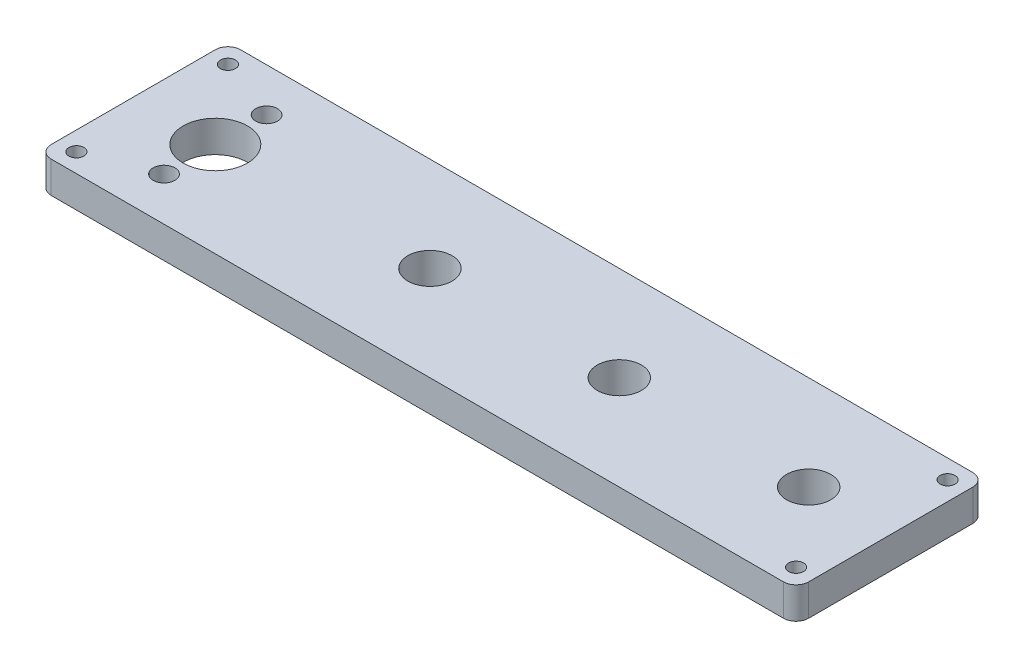
ISO-10303-21;
HEADER;
FILE_DESCRIPTION(('STEP AP214'),'2;1');
FILE_NAME('part.step','',(''),(''),'','','');
FILE_SCHEMA(('AUTOMOTIVE_DESIGN { 1 0 10303 214 1 1 1 1 }'));
ENDSEC;
DATA;
#1=APPLICATION_CONTEXT('core data for automotive mechanical design processes');
#2=APPLICATION_PROTOCOL_DEFINITION('international standard','automotive_design',2000,#1);
#3=PRODUCT_CONTEXT('',#1,'mechanical');
#4=PRODUCT('Part','Part','',(#3));
#5=PRODUCT_RELATED_PRODUCT_CATEGORY('part','',(#4));
#6=PRODUCT_DEFINITION_FORMATION('','',#4);
#7=PRODUCT_DEFINITION_CONTEXT('part definition',#1,'design');
#8=PRODUCT_DEFINITION('design','',#6,#7);
#9=PRODUCT_DEFINITION_SHAPE('','',#8);
#10=(LENGTH_UNIT() NAMED_UNIT(*) SI_UNIT(.MILLI.,.METRE.));
#11=(NAMED_UNIT(*) PLANE_ANGLE_UNIT() SI_UNIT($,.RADIAN.));
#12=(NAMED_UNIT(*) SI_UNIT($,.STERADIAN.) SOLID_ANGLE_UNIT());
#13=UNCERTAINTY_MEASURE_WITH_UNIT(LENGTH_MEASURE(1.E-05),#10,'distance_accuracy_value','');
#14=(GEOMETRIC_REPRESENTATION_CONTEXT(3) GLOBAL_UNCERTAINTY_ASSIGNED_CONTEXT((#13)) GLOBAL_UNIT_ASSIGNED_CONTEXT((#10,
#11,#12)) REPRESENTATION_CONTEXT('',''));
#15=CARTESIAN_POINT('',(0.,0.,0.));
#16=DIRECTION('',(0.,0.,1.));
#17=DIRECTION('',(1.,0.,0.));
#18=AXIS2_PLACEMENT_3D('',#15,#16,#17);
#19=CARTESIAN_POINT('',(-35.56,6.35,-16.51));
#20=DIRECTION('',(0.,-1.,0.));
#21=DIRECTION('',(0.,0.,-1.));
#22=AXIS2_PLACEMENT_3D('',#19,#20,#21);
#23=PLANE('',#22);
#24=CARTESIAN_POINT('',(-34.29,6.35,-15.24));
#25=DIRECTION('',(0.,1.,0.));
#26=DIRECTION('',(0.,0.,1.));
#27=AXIS2_PLACEMENT_3D('',#24,#25,#26);
#28=CIRCLE('',#27,1.5113);
#29=CARTESIAN_POINT('',(-34.29,6.35,-13.7287));
#30=VERTEX_POINT('',#29);
#31=EDGE_CURVE('E235',#30,#30,#28,.T.);
#32=ORIENTED_EDGE('',*,*,#31,.F.);
#33=EDGE_LOOP('',(#32));
#34=FACE_BOUND('',#33,.T.);
#35=CARTESIAN_POINT('',(110.49,6.35,-15.24));
#36=DIRECTION('',(0.,1.,0.));
#37=DIRECTION('',(0.,0.,1.));
#38=AXIS2_PLACEMENT_3D('',#35,#36,#37);
#39=CIRCLE('',#38,1.51129999999999);
#40=CARTESIAN_POINT('',(110.49,6.35,-13.7287));
#41=VERTEX_POINT('',#40);
#42=EDGE_CURVE('E237',#41,#41,#39,.T.);
#43=ORIENTED_EDGE('',*,*,#42,.F.);
#44=EDGE_LOOP('',(#43));
#45=FACE_BOUND('',#44,.T.);
#46=CARTESIAN_POINT('',(110.49,6.35,15.24));
#47=DIRECTION('',(0.,1.,0.));
#48=DIRECTION('',(0.,0.,1.));
#49=AXIS2_PLACEMENT_3D('',#46,#47,#48);
#50=CIRCLE('',#49,1.51129999999999);
#51=CARTESIAN_POINT('',(110.49,6.35,16.7513));
#52=VERTEX_POINT('',#51);
#53=EDGE_CURVE('E245',#52,#52,#50,.T.);
#54=ORIENTED_EDGE('',*,*,#53,.F.);
#55=EDGE_LOOP('',(#54));
#56=FACE_BOUND('',#55,.T.);
#57=CARTESIAN_POINT('',(21.59,6.35,0.));
#58=DIRECTION('',(0.,-1.,0.));
#59=DIRECTION('',(0.,0.,1.));
#60=AXIS2_PLACEMENT_3D('',#57,#58,#59);
#61=CIRCLE('',#60,4.445);
#62=CARTESIAN_POINT('',(21.59,6.35,4.445));
#63=VERTEX_POINT('',#62);
#64=EDGE_CURVE('E258',#63,#63,#61,.T.);
#65=ORIENTED_EDGE('',*,*,#64,.T.);
#66=EDGE_LOOP('',(#65));
#67=FACE_BOUND('',#66,.T.);
#68=CARTESIAN_POINT('',(-21.59,6.35,10.31875));
#69=DIRECTION('',(0.,-1.,0.));
#70=DIRECTION('',(0.,0.,-1.));
#71=AXIS2_PLACEMENT_3D('',#68,#69,#70);
#72=CIRCLE('',#71,2.19075000000001);
#73=CARTESIAN_POINT('',(-21.59,6.35,8.128));
#74=VERTEX_POINT('',#73);
#75=EDGE_CURVE('E264',#74,#74,#72,.T.);
#76=ORIENTED_EDGE('',*,*,#75,.T.);
#77=EDGE_LOOP('',(#76));
#78=FACE_BOUND('',#77,.T.);
#79=CARTESIAN_POINT('',(-21.59,6.35,-10.31875));
#80=DIRECTION('',(0.,-1.,0.));
#81=DIRECTION('',(0.,0.,-1.));
#82=AXIS2_PLACEMENT_3D('',#79,#80,#81);
#83=CIRCLE('',#82,2.19075000000001);
#84=CARTESIAN_POINT('',(-21.59,6.35,-12.5095));
#85=VERTEX_POINT('',#84);
#86=EDGE_CURVE('E270',#85,#85,#83,.T.);
#87=ORIENTED_EDGE('',*,*,#86,.T.);
#88=EDGE_LOOP('',(#87));
#89=FACE_BOUND('',#88,.T.);
#90=CARTESIAN_POINT('',(-21.59,6.35,0.));
#91=DIRECTION('',(0.,-1.,0.));
#92=DIRECTION('',(0.,0.,-1.));
#93=AXIS2_PLACEMENT_3D('',#90,#91,#92);
#94=CIRCLE('',#93,6.477);
#95=CARTESIAN_POINT('',(-21.59,6.35,-6.477));
#96=VERTEX_POINT('',#95);
#97=EDGE_CURVE('E276',#96,#96,#94,.T.);
#98=ORIENTED_EDGE('',*,*,#97,.T.);
#99=EDGE_LOOP('',(#98));
#100=FACE_BOUND('',#99,.T.);
#101=CARTESIAN_POINT('',(97.79,6.35,0.));
#102=DIRECTION('',(0.,-1.,0.));
#103=DIRECTION('',(0.,0.,-1.));
#104=AXIS2_PLACEMENT_3D('',#101,#102,#103);
#105=CIRCLE('',#104,4.445);
#106=CARTESIAN_POINT('',(97.79,6.35,-4.445));
#107=VERTEX_POINT('',#106);
#108=EDGE_CURVE('E282',#107,#107,#105,.T.);
#109=ORIENTED_EDGE('',*,*,#108,.T.);
#110=EDGE_LOOP('',(#109));
#111=FACE_BOUND('',#110,.T.);
#112=CARTESIAN_POINT('',(59.69,6.35,0.));
#113=DIRECTION('',(0.,-1.,0.));
#114=DIRECTION('',(0.,0.,-1.));
#115=AXIS2_PLACEMENT_3D('',#112,#113,#114);
#116=CIRCLE('',#115,4.445);
#117=CARTESIAN_POINT('',(59.69,6.35,-4.445));
#118=VERTEX_POINT('',#117);
#119=EDGE_CURVE('E140',#118,#118,#116,.T.);
#120=ORIENTED_EDGE('',*,*,#119,.T.);
#121=EDGE_LOOP('',(#120));
#122=FACE_BOUND('',#121,.T.);
#123=CARTESIAN_POINT('',(-35.56,6.35,-16.51));
#124=DIRECTION('',(0.,-1.,0.));
#125=DIRECTION('',(0.,0.,-1.));
#126=AXIS2_PLACEMENT_3D('',#123,#124,#125);
#127=CIRCLE('',#126,2.54);
#128=CARTESIAN_POINT('',(-38.1,6.35,-16.51));
#129=VERTEX_POINT('',#128);
#130=CARTESIAN_POINT('',(-35.56,6.35,-19.05));
#131=VERTEX_POINT('',#130);
#132=EDGE_CURVE('E157',#129,#131,#127,.T.);
#133=ORIENTED_EDGE('',*,*,#132,.F.);
#134=DIRECTION('',(0.,0.,-1.));
#135=VECTOR('',#134,1.);
#136=CARTESIAN_POINT('',(-38.1,6.35,16.51));
#137=LINE('',#136,#135);
#138=CARTESIAN_POINT('',(-38.1,6.35,16.51));
#139=VERTEX_POINT('',#138);
#140=EDGE_CURVE('E126',#139,#129,#137,.T.);
#141=ORIENTED_EDGE('',*,*,#140,.F.);
#142=CARTESIAN_POINT('',(-35.56,6.35,16.51));
#143=DIRECTION('',(0.,-1.,0.));
#144=DIRECTION('',(0.,0.,-1.));
#145=AXIS2_PLACEMENT_3D('',#142,#143,#144);
#146=CIRCLE('',#145,2.54);
#147=CARTESIAN_POINT('',(-35.56,6.35,19.05));
#148=VERTEX_POINT('',#147);
#149=EDGE_CURVE('E111',#148,#139,#146,.T.);
#150=ORIENTED_EDGE('',*,*,#149,.F.);
#151=DIRECTION('',(-1.,0.,0.));
#152=VECTOR('',#151,1.);
#153=CARTESIAN_POINT('',(111.76,6.35,19.05));
#154=LINE('',#153,#152);
#155=CARTESIAN_POINT('',(111.76,6.35,19.05));
#156=VERTEX_POINT('',#155);
#157=EDGE_CURVE('E124',#156,#148,#154,.T.);
#158=ORIENTED_EDGE('',*,*,#157,.F.);
#159=CARTESIAN_POINT('',(111.76,6.35,16.51));
#160=DIRECTION('',(0.,-1.,0.));
#161=DIRECTION('',(0.,0.,-1.));
#162=AXIS2_PLACEMENT_3D('',#159,#160,#161);
#163=CIRCLE('',#162,2.54);
#164=CARTESIAN_POINT('',(114.3,6.35,16.51));
#165=VERTEX_POINT('',#164);
#166=EDGE_CURVE('E129',#165,#156,#163,.T.);
#167=ORIENTED_EDGE('',*,*,#166,.F.);
#168=DIRECTION('',(0.,0.,1.));
#169=VECTOR('',#168,1.);
#170=CARTESIAN_POINT('',(114.3,6.35,-16.51));
#171=LINE('',#170,#169);
#172=CARTESIAN_POINT('',(114.3,6.35,-16.51));
#173=VERTEX_POINT('',#172);
#174=EDGE_CURVE('E131',#173,#165,#171,.T.);
#175=ORIENTED_EDGE('',*,*,#174,.F.);
#176=CARTESIAN_POINT('',(111.76,6.35,-16.51));
#177=DIRECTION('',(0.,-1.,0.));
#178=DIRECTION('',(0.,0.,-1.));
#179=AXIS2_PLACEMENT_3D('',#176,#177,#178);
#180=CIRCLE('',#179,2.54);
#181=CARTESIAN_POINT('',(111.76,6.35,-19.05));
#182=VERTEX_POINT('',#181);
#183=EDGE_CURVE('E295',#182,#173,#180,.T.);
#184=ORIENTED_EDGE('',*,*,#183,.F.);
#185=DIRECTION('',(1.,0.,0.));
#186=VECTOR('',#185,1.);
#187=CARTESIAN_POINT('',(-35.56,6.35,-19.05));
#188=LINE('',#187,#186);
#189=EDGE_CURVE('E293',#131,#182,#188,.T.);
#190=ORIENTED_EDGE('',*,*,#189,.F.);
#191=EDGE_LOOP('',(#133,#141,#150,#158,#167,#175,#184,#190));
#192=FACE_BOUND('',#191,.T.);
#193=CARTESIAN_POINT('',(-34.29,6.35,15.24));
#194=DIRECTION('',(0.,1.,0.));
#195=DIRECTION('',(0.,0.,1.));
#196=AXIS2_PLACEMENT_3D('',#193,#194,#195);
#197=CIRCLE('',#196,1.5113);
#198=CARTESIAN_POINT('',(-34.29,6.35,16.7513));
#199=VERTEX_POINT('',#198);
#200=EDGE_CURVE('E251',#199,#199,#197,.T.);
#201=ORIENTED_EDGE('',*,*,#200,.F.);
#202=EDGE_LOOP('',(#201));
#203=FACE_BOUND('',#202,.T.);
#204=ADVANCED_FACE('F38',(#34,#45,#56,#67,#78,#89,#100,#111,#122,#192,#203),#23,.F.);
#205=CARTESIAN_POINT('',(-35.56,0.,-16.51));
#206=DIRECTION('',(0.,-1.,0.));
#207=DIRECTION('',(0.,0.,-1.));
#208=AXIS2_PLACEMENT_3D('',#205,#206,#207);
#209=PLANE('',#208);
#210=CARTESIAN_POINT('',(-34.29,0.,-15.24));
#211=DIRECTION('',(0.,1.,0.));
#212=DIRECTION('',(0.,0.,1.));
#213=AXIS2_PLACEMENT_3D('',#210,#211,#212);
#214=CIRCLE('',#213,1.5113);
#215=CARTESIAN_POINT('',(-34.29,0.,-13.7287));
#216=VERTEX_POINT('',#215);
#217=EDGE_CURVE('E233',#216,#216,#214,.T.);
#218=ORIENTED_EDGE('',*,*,#217,.T.);
#219=EDGE_LOOP('',(#218));
#220=FACE_BOUND('',#219,.T.);
#221=CARTESIAN_POINT('',(110.49,0.,-15.24));
#222=DIRECTION('',(0.,1.,0.));
#223=DIRECTION('',(0.,0.,1.));
#224=AXIS2_PLACEMENT_3D('',#221,#222,#223);
#225=CIRCLE('',#224,1.51129999999999);
#226=CARTESIAN_POINT('',(110.49,0.,-13.7287));
#227=VERTEX_POINT('',#226);
#228=EDGE_CURVE('E242',#227,#227,#225,.T.);
#229=ORIENTED_EDGE('',*,*,#228,.T.);
#230=EDGE_LOOP('',(#229));
#231=FACE_BOUND('',#230,.T.);
#232=CARTESIAN_POINT('',(110.49,0.,15.24));
#233=DIRECTION('',(0.,1.,0.));
#234=DIRECTION('',(0.,0.,1.));
#235=AXIS2_PLACEMENT_3D('',#232,#233,#234);
#236=CIRCLE('',#235,1.51129999999999);
#237=CARTESIAN_POINT('',(110.49,0.,16.7513));
#238=VERTEX_POINT('',#237);
#239=EDGE_CURVE('E248',#238,#238,#236,.T.);
#240=ORIENTED_EDGE('',*,*,#239,.T.);
#241=EDGE_LOOP('',(#240));
#242=FACE_BOUND('',#241,.T.);
#243=CARTESIAN_POINT('',(-35.56,0.,-16.51));
#244=DIRECTION('',(0.,-1.,0.));
#245=DIRECTION('',(0.,0.,-1.));
#246=AXIS2_PLACEMENT_3D('',#243,#244,#245);
#247=CIRCLE('',#246,2.54);
#248=CARTESIAN_POINT('',(-38.1,0.,-16.51));
#249=VERTEX_POINT('',#248);
#250=CARTESIAN_POINT('',(-35.56,0.,-19.05));
#251=VERTEX_POINT('',#250);
#252=EDGE_CURVE('E136',#249,#251,#247,.T.);
#253=ORIENTED_EDGE('',*,*,#252,.T.);
#254=DIRECTION('',(1.,0.,0.));
#255=VECTOR('',#254,1.);
#256=CARTESIAN_POINT('',(-35.56,0.,-19.05));
#257=LINE('',#256,#255);
#258=CARTESIAN_POINT('',(111.76,0.,-19.05));
#259=VERTEX_POINT('',#258);
#260=EDGE_CURVE('E139',#251,#259,#257,.T.);
#261=ORIENTED_EDGE('',*,*,#260,.T.);
#262=CARTESIAN_POINT('',(111.76,0.,-16.51));
#263=DIRECTION('',(0.,-1.,0.));
#264=DIRECTION('',(0.,0.,-1.));
#265=AXIS2_PLACEMENT_3D('',#262,#263,#264);
#266=CIRCLE('',#265,2.54);
#267=CARTESIAN_POINT('',(114.3,0.,-16.51));
#268=VERTEX_POINT('',#267);
#269=EDGE_CURVE('E143',#259,#268,#266,.T.);
#270=ORIENTED_EDGE('',*,*,#269,.T.);
#271=DIRECTION('',(0.,0.,1.));
#272=VECTOR('',#271,1.);
#273=CARTESIAN_POINT('',(114.3,0.,-16.51));
#274=LINE('',#273,#272);
#275=CARTESIAN_POINT('',(114.3,0.,16.51));
#276=VERTEX_POINT('',#275);
#277=EDGE_CURVE('E146',#268,#276,#274,.T.);
#278=ORIENTED_EDGE('',*,*,#277,.T.);
#279=CARTESIAN_POINT('',(111.76,0.,16.51));
#280=DIRECTION('',(0.,-1.,0.));
#281=DIRECTION('',(0.,0.,-1.));
#282=AXIS2_PLACEMENT_3D('',#279,#280,#281);
#283=CIRCLE('',#282,2.54);
#284=CARTESIAN_POINT('',(111.76,0.,19.05));
#285=VERTEX_POINT('',#284);
#286=EDGE_CURVE('E149',#276,#285,#283,.T.);
#287=ORIENTED_EDGE('',*,*,#286,.T.);
#288=DIRECTION('',(-1.,0.,0.));
#289=VECTOR('',#288,1.);
#290=CARTESIAN_POINT('',(111.76,0.,19.05));
#291=LINE('',#290,#289);
#292=CARTESIAN_POINT('',(-35.56,0.,19.05));
#293=VERTEX_POINT('',#292);
#294=EDGE_CURVE('E152',#285,#293,#291,.T.);
#295=ORIENTED_EDGE('',*,*,#294,.T.);
#296=CARTESIAN_POINT('',(-35.56,0.,16.51));
#297=DIRECTION('',(0.,-1.,0.));
#298=DIRECTION('',(0.,0.,-1.));
#299=AXIS2_PLACEMENT_3D('',#296,#297,#298);
#300=CIRCLE('',#299,2.54);
#301=CARTESIAN_POINT('',(-38.1,0.,16.51));
#302=VERTEX_POINT('',#301);
#303=EDGE_CURVE('E113',#293,#302,#300,.T.);
#304=ORIENTED_EDGE('',*,*,#303,.T.);
#305=DIRECTION('',(0.,0.,-1.));
#306=VECTOR('',#305,1.);
#307=CARTESIAN_POINT('',(-38.1,0.,16.51));
#308=LINE('',#307,#306);
#309=EDGE_CURVE('E155',#302,#249,#308,.T.);
#310=ORIENTED_EDGE('',*,*,#309,.T.);
#311=EDGE_LOOP('',(#253,#261,#270,#278,#287,#295,#304,#310));
#312=FACE_BOUND('',#311,.T.);
#313=CARTESIAN_POINT('',(59.69,0.,0.));
#314=DIRECTION('',(0.,-1.,0.));
#315=DIRECTION('',(0.,0.,-1.));
#316=AXIS2_PLACEMENT_3D('',#313,#314,#315);
#317=CIRCLE('',#316,4.445);
#318=CARTESIAN_POINT('',(59.69,0.,-4.445));
#319=VERTEX_POINT('',#318);
#320=EDGE_CURVE('E285',#319,#319,#317,.T.);
#321=ORIENTED_EDGE('',*,*,#320,.F.);
#322=EDGE_LOOP('',(#321));
#323=FACE_BOUND('',#322,.T.);
#324=CARTESIAN_POINT('',(97.79,0.,0.));
#325=DIRECTION('',(0.,-1.,0.));
#326=DIRECTION('',(0.,0.,-1.));
#327=AXIS2_PLACEMENT_3D('',#324,#325,#326);
#328=CIRCLE('',#327,4.445);
#329=CARTESIAN_POINT('',(97.79,0.,-4.445));
#330=VERTEX_POINT('',#329);
#331=EDGE_CURVE('E279',#330,#330,#328,.T.);
#332=ORIENTED_EDGE('',*,*,#331,.F.);
#333=EDGE_LOOP('',(#332));
#334=FACE_BOUND('',#333,.T.);
#335=CARTESIAN_POINT('',(-21.59,0.,0.));
#336=DIRECTION('',(0.,-1.,0.));
#337=DIRECTION('',(0.,0.,-1.));
#338=AXIS2_PLACEMENT_3D('',#335,#336,#337);
#339=CIRCLE('',#338,6.477);
#340=CARTESIAN_POINT('',(-21.59,0.,-6.477));
#341=VERTEX_POINT('',#340);
#342=EDGE_CURVE('E273',#341,#341,#339,.T.);
#343=ORIENTED_EDGE('',*,*,#342,.F.);
#344=EDGE_LOOP('',(#343));
#345=FACE_BOUND('',#344,.T.);
#346=CARTESIAN_POINT('',(-21.59,0.,-10.31875));
#347=DIRECTION('',(0.,-1.,0.));
#348=DIRECTION('',(0.,0.,-1.));
#349=AXIS2_PLACEMENT_3D('',#346,#347,#348);
#350=CIRCLE('',#349,2.19075000000001);
#351=CARTESIAN_POINT('',(-21.59,0.,-12.5095));
#352=VERTEX_POINT('',#351);
#353=EDGE_CURVE('E267',#352,#352,#350,.T.);
#354=ORIENTED_EDGE('',*,*,#353,.F.);
#355=EDGE_LOOP('',(#354));
#356=FACE_BOUND('',#355,.T.);
#357=CARTESIAN_POINT('',(-21.59,0.,10.31875));
#358=DIRECTION('',(0.,-1.,0.));
#359=DIRECTION('',(0.,0.,-1.));
#360=AXIS2_PLACEMENT_3D('',#357,#358,#359);
#361=CIRCLE('',#360,2.19075000000001);
#362=CARTESIAN_POINT('',(-21.59,0.,8.128));
#363=VERTEX_POINT('',#362);
#364=EDGE_CURVE('E261',#363,#363,#361,.T.);
#365=ORIENTED_EDGE('',*,*,#364,.F.);
#366=EDGE_LOOP('',(#365));
#367=FACE_BOUND('',#366,.T.);
#368=CARTESIAN_POINT('',(21.59,0.,0.));
#369=DIRECTION('',(0.,-1.,0.));
#370=DIRECTION('',(0.,0.,1.));
#371=AXIS2_PLACEMENT_3D('',#368,#369,#370);
#372=CIRCLE('',#371,4.445);
#373=CARTESIAN_POINT('',(21.59,0.,4.445));
#374=VERTEX_POINT('',#373);
#375=EDGE_CURVE('E257',#374,#374,#372,.T.);
#376=ORIENTED_EDGE('',*,*,#375,.F.);
#377=EDGE_LOOP('',(#376));
#378=FACE_BOUND('',#377,.T.);
#379=CARTESIAN_POINT('',(-34.29,0.,15.24));
#380=DIRECTION('',(0.,1.,0.));
#381=DIRECTION('',(0.,0.,1.));
#382=AXIS2_PLACEMENT_3D('',#379,#380,#381);
#383=CIRCLE('',#382,1.5113);
#384=CARTESIAN_POINT('',(-34.29,0.,16.7513));
#385=VERTEX_POINT('',#384);
#386=EDGE_CURVE('E254',#385,#385,#383,.T.);
#387=ORIENTED_EDGE('',*,*,#386,.T.);
#388=EDGE_LOOP('',(#387));
#389=FACE_BOUND('',#388,.T.);
#390=ADVANCED_FACE('F168',(#220,#231,#242,#312,#323,#334,#345,#356,#367,#378,#389),#209,.T.);
#391=CARTESIAN_POINT('',(-35.56,6.35,-16.51));
#392=DIRECTION('',(0.,-1.,0.));
#393=DIRECTION('',(0.,0.,-1.));
#394=AXIS2_PLACEMENT_3D('',#391,#392,#393);
#395=CYLINDRICAL_SURFACE('',#394,2.54);
#396=ORIENTED_EDGE('',*,*,#252,.F.);
#397=DIRECTION('',(0.,-1.,0.));
#398=VECTOR('',#397,1.);
#399=CARTESIAN_POINT('',(-38.1,6.35,-16.51));
#400=LINE('',#399,#398);
#401=EDGE_CURVE('E11',#129,#249,#400,.T.);
#402=ORIENTED_EDGE('',*,*,#401,.F.);
#403=ORIENTED_EDGE('',*,*,#132,.T.);
#404=DIRECTION('',(0.,-1.,0.));
#405=VECTOR('',#404,1.);
#406=CARTESIAN_POINT('',(-35.56,6.35,-19.05));
#407=LINE('',#406,#405);
#408=EDGE_CURVE('E42',#131,#251,#407,.T.);
#409=ORIENTED_EDGE('',*,*,#408,.T.);
#410=EDGE_LOOP('',(#396,#402,#403,#409));
#411=FACE_BOUND('',#410,.T.);
#412=ADVANCED_FACE('F40',(#411),#395,.T.);
#413=CARTESIAN_POINT('',(-38.1,6.35,16.51));
#414=DIRECTION('',(-1.,0.,0.));
#415=DIRECTION('',(0.,0.,1.));
#416=AXIS2_PLACEMENT_3D('',#413,#414,#415);
#417=PLANE('',#416);
#418=ORIENTED_EDGE('',*,*,#309,.F.);
#419=DIRECTION('',(0.,-1.,0.));
#420=VECTOR('',#419,1.);
#421=CARTESIAN_POINT('',(-38.1,6.35,16.51));
#422=LINE('',#421,#420);
#423=EDGE_CURVE('E48',#139,#302,#422,.T.);
#424=ORIENTED_EDGE('',*,*,#423,.F.);
#425=ORIENTED_EDGE('',*,*,#140,.T.);
#426=ORIENTED_EDGE('',*,*,#401,.T.);
#427=EDGE_LOOP('',(#418,#424,#425,#426));
#428=FACE_BOUND('',#427,.T.);
#429=ADVANCED_FACE('F170',(#428),#417,.T.);
#430=CARTESIAN_POINT('',(-35.56,6.35,16.51));
#431=DIRECTION('',(0.,-1.,0.));
#432=DIRECTION('',(0.,0.,-1.));
#433=AXIS2_PLACEMENT_3D('',#430,#431,#432);
#434=CYLINDRICAL_SURFACE('',#433,2.54);
#435=ORIENTED_EDGE('',*,*,#303,.F.);
#436=DIRECTION('',(0.,-1.,0.));
#437=VECTOR('',#436,1.);
#438=CARTESIAN_POINT('',(-35.56,6.35,19.05));
#439=LINE('',#438,#437);
#440=EDGE_CURVE('E108',#148,#293,#439,.T.);
#441=ORIENTED_EDGE('',*,*,#440,.F.);
#442=ORIENTED_EDGE('',*,*,#149,.T.);
#443=ORIENTED_EDGE('',*,*,#423,.T.);
#444=EDGE_LOOP('',(#435,#441,#442,#443));
#445=FACE_BOUND('',#444,.T.);
#446=ADVANCED_FACE('F110',(#445),#434,.T.);
#447=CARTESIAN_POINT('',(111.76,6.35,19.05));
#448=DIRECTION('',(0.,0.,1.));
#449=DIRECTION('',(1.,0.,0.));
#450=AXIS2_PLACEMENT_3D('',#447,#448,#449);
#451=PLANE('',#450);
#452=ORIENTED_EDGE('',*,*,#294,.F.);
#453=DIRECTION('',(0.,-1.,0.));
#454=VECTOR('',#453,1.);
#455=CARTESIAN_POINT('',(111.76,6.35,19.05));
#456=LINE('',#455,#454);
#457=EDGE_CURVE('E118',#156,#285,#456,.T.);
#458=ORIENTED_EDGE('',*,*,#457,.F.);
#459=ORIENTED_EDGE('',*,*,#157,.T.);
#460=ORIENTED_EDGE('',*,*,#440,.T.);
#461=EDGE_LOOP('',(#452,#458,#459,#460));
#462=FACE_BOUND('',#461,.T.);
#463=ADVANCED_FACE('F128',(#462),#451,.T.);
#464=CARTESIAN_POINT('',(111.76,6.35,16.51));
#465=DIRECTION('',(0.,-1.,0.));
#466=DIRECTION('',(0.,0.,-1.));
#467=AXIS2_PLACEMENT_3D('',#464,#465,#466);
#468=CYLINDRICAL_SURFACE('',#467,2.54);
#469=ORIENTED_EDGE('',*,*,#286,.F.);
#470=DIRECTION('',(0.,-1.,0.));
#471=VECTOR('',#470,1.);
#472=CARTESIAN_POINT('',(114.3,6.35,16.51));
#473=LINE('',#472,#471);
#474=EDGE_CURVE('E161',#165,#276,#473,.T.);
#475=ORIENTED_EDGE('',*,*,#474,.F.);
#476=ORIENTED_EDGE('',*,*,#166,.T.);
#477=ORIENTED_EDGE('',*,*,#457,.T.);
#478=EDGE_LOOP('',(#469,#475,#476,#477));
#479=FACE_BOUND('',#478,.T.);
#480=ADVANCED_FACE('F307',(#479),#468,.T.);
#481=CARTESIAN_POINT('',(114.3,6.35,-16.51));
#482=DIRECTION('',(1.,0.,0.));
#483=DIRECTION('',(0.,0.,-1.));
#484=AXIS2_PLACEMENT_3D('',#481,#482,#483);
#485=PLANE('',#484);
#486=ORIENTED_EDGE('',*,*,#277,.F.);
#487=DIRECTION('',(0.,-1.,0.));
#488=VECTOR('',#487,1.);
#489=CARTESIAN_POINT('',(114.3,6.35,-16.51));
#490=LINE('',#489,#488);
#491=EDGE_CURVE('E163',#173,#268,#490,.T.);
#492=ORIENTED_EDGE('',*,*,#491,.F.);
#493=ORIENTED_EDGE('',*,*,#174,.T.);
#494=ORIENTED_EDGE('',*,*,#474,.T.);
#495=EDGE_LOOP('',(#486,#492,#493,#494));
#496=FACE_BOUND('',#495,.T.);
#497=ADVANCED_FACE('F301',(#496),#485,.T.);
#498=CARTESIAN_POINT('',(111.76,6.35,-16.51));
#499=DIRECTION('',(0.,-1.,0.));
#500=DIRECTION('',(0.,0.,-1.));
#501=AXIS2_PLACEMENT_3D('',#498,#499,#500);
#502=CYLINDRICAL_SURFACE('',#501,2.54);
#503=ORIENTED_EDGE('',*,*,#269,.F.);
#504=DIRECTION('',(0.,-1.,0.));
#505=VECTOR('',#504,1.);
#506=CARTESIAN_POINT('',(111.76,6.35,-19.05));
#507=LINE('',#506,#505);
#508=EDGE_CURVE('E164',#182,#259,#507,.T.);
#509=ORIENTED_EDGE('',*,*,#508,.F.);
#510=ORIENTED_EDGE('',*,*,#183,.T.);
#511=ORIENTED_EDGE('',*,*,#491,.T.);
#512=EDGE_LOOP('',(#503,#509,#510,#511));
#513=FACE_BOUND('',#512,.T.);
#514=ADVANCED_FACE('F305',(#513),#502,.T.);
#515=CARTESIAN_POINT('',(-35.56,6.35,-19.05));
#516=DIRECTION('',(0.,0.,-1.));
#517=DIRECTION('',(-1.,0.,0.));
#518=AXIS2_PLACEMENT_3D('',#515,#516,#517);
#519=PLANE('',#518);
#520=ORIENTED_EDGE('',*,*,#260,.F.);
#521=ORIENTED_EDGE('',*,*,#408,.F.);
#522=ORIENTED_EDGE('',*,*,#189,.T.);
#523=ORIENTED_EDGE('',*,*,#508,.T.);
#524=EDGE_LOOP('',(#520,#521,#522,#523));
#525=FACE_BOUND('',#524,.T.);
#526=ADVANCED_FACE('F166',(#525),#519,.T.);
#527=CARTESIAN_POINT('',(59.69,6.35,0.));
#528=DIRECTION('',(0.,-1.,0.));
#529=DIRECTION('',(0.,0.,-1.));
#530=AXIS2_PLACEMENT_3D('',#527,#528,#529);
#531=CYLINDRICAL_SURFACE('',#530,4.445);
#532=ORIENTED_EDGE('',*,*,#119,.F.);
#533=EDGE_LOOP('',(#532));
#534=FACE_BOUND('',#533,.T.);
#535=ORIENTED_EDGE('',*,*,#320,.T.);
#536=EDGE_LOOP('',(#535));
#537=FACE_BOUND('',#536,.T.);
#538=ADVANCED_FACE('F189',(#534,#537),#531,.F.);
#539=CARTESIAN_POINT('',(97.79,6.35,0.));
#540=DIRECTION('',(0.,-1.,0.));
#541=DIRECTION('',(0.,0.,-1.));
#542=AXIS2_PLACEMENT_3D('',#539,#540,#541);
#543=CYLINDRICAL_SURFACE('',#542,4.445);
#544=ORIENTED_EDGE('',*,*,#108,.F.);
#545=EDGE_LOOP('',(#544));
#546=FACE_BOUND('',#545,.T.);
#547=ORIENTED_EDGE('',*,*,#331,.T.);
#548=EDGE_LOOP('',(#547));
#549=FACE_BOUND('',#548,.T.);
#550=ADVANCED_FACE('F192',(#546,#549),#543,.F.);
#551=CARTESIAN_POINT('',(-21.59,6.35,0.));
#552=DIRECTION('',(0.,-1.,0.));
#553=DIRECTION('',(0.,0.,-1.));
#554=AXIS2_PLACEMENT_3D('',#551,#552,#553);
#555=CYLINDRICAL_SURFACE('',#554,6.477);
#556=ORIENTED_EDGE('',*,*,#97,.F.);
#557=EDGE_LOOP('',(#556));
#558=FACE_BOUND('',#557,.T.);
#559=ORIENTED_EDGE('',*,*,#342,.T.);
#560=EDGE_LOOP('',(#559));
#561=FACE_BOUND('',#560,.T.);
#562=ADVANCED_FACE('F196',(#558,#561),#555,.F.);
#563=CARTESIAN_POINT('',(-21.59,6.35,-10.31875));
#564=DIRECTION('',(0.,-1.,0.));
#565=DIRECTION('',(0.,0.,-1.));
#566=AXIS2_PLACEMENT_3D('',#563,#564,#565);
#567=CYLINDRICAL_SURFACE('',#566,2.19075000000001);
#568=ORIENTED_EDGE('',*,*,#86,.F.);
#569=EDGE_LOOP('',(#568));
#570=FACE_BOUND('',#569,.T.);
#571=ORIENTED_EDGE('',*,*,#353,.T.);
#572=EDGE_LOOP('',(#571));
#573=FACE_BOUND('',#572,.T.);
#574=ADVANCED_FACE('F200',(#570,#573),#567,.F.);
#575=CARTESIAN_POINT('',(-21.59,6.35,10.31875));
#576=DIRECTION('',(0.,-1.,0.));
#577=DIRECTION('',(0.,0.,-1.));
#578=AXIS2_PLACEMENT_3D('',#575,#576,#577);
#579=CYLINDRICAL_SURFACE('',#578,2.19075000000001);
#580=ORIENTED_EDGE('',*,*,#75,.F.);
#581=EDGE_LOOP('',(#580));
#582=FACE_BOUND('',#581,.T.);
#583=ORIENTED_EDGE('',*,*,#364,.T.);
#584=EDGE_LOOP('',(#583));
#585=FACE_BOUND('',#584,.T.);
#586=ADVANCED_FACE('F204',(#582,#585),#579,.F.);
#587=CARTESIAN_POINT('',(21.59,6.35,0.));
#588=DIRECTION('',(0.,-1.,0.));
#589=DIRECTION('',(0.,0.,-1.));
#590=AXIS2_PLACEMENT_3D('',#587,#588,#589);
#591=CYLINDRICAL_SURFACE('',#590,4.445);
#592=ORIENTED_EDGE('',*,*,#64,.F.);
#593=EDGE_LOOP('',(#592));
#594=FACE_BOUND('',#593,.T.);
#595=ORIENTED_EDGE('',*,*,#375,.T.);
#596=EDGE_LOOP('',(#595));
#597=FACE_BOUND('',#596,.T.);
#598=ADVANCED_FACE('F208',(#594,#597),#591,.F.);
#599=CARTESIAN_POINT('',(-34.29,6.35,15.24));
#600=DIRECTION('',(0.,1.,0.));
#601=DIRECTION('',(0.,0.,1.));
#602=AXIS2_PLACEMENT_3D('',#599,#600,#601);
#603=CYLINDRICAL_SURFACE('',#602,1.5113);
#604=ORIENTED_EDGE('',*,*,#386,.F.);
#605=EDGE_LOOP('',(#604));
#606=FACE_BOUND('',#605,.T.);
#607=ORIENTED_EDGE('',*,*,#200,.T.);
#608=EDGE_LOOP('',(#607));
#609=FACE_BOUND('',#608,.T.);
#610=ADVANCED_FACE('F212',(#606,#609),#603,.F.);
#611=CARTESIAN_POINT('',(110.49,6.35,15.24));
#612=DIRECTION('',(0.,1.,0.));
#613=DIRECTION('',(0.,0.,1.));
#614=AXIS2_PLACEMENT_3D('',#611,#612,#613);
#615=CYLINDRICAL_SURFACE('',#614,1.51129999999999);
#616=ORIENTED_EDGE('',*,*,#239,.F.);
#617=EDGE_LOOP('',(#616));
#618=FACE_BOUND('',#617,.T.);
#619=ORIENTED_EDGE('',*,*,#53,.T.);
#620=EDGE_LOOP('',(#619));
#621=FACE_BOUND('',#620,.T.);
#622=ADVANCED_FACE('F216',(#618,#621),#615,.F.);
#623=CARTESIAN_POINT('',(110.49,6.35,-15.24));
#624=DIRECTION('',(0.,1.,0.));
#625=DIRECTION('',(0.,0.,1.));
#626=AXIS2_PLACEMENT_3D('',#623,#624,#625);
#627=CYLINDRICAL_SURFACE('',#626,1.51129999999999);
#628=ORIENTED_EDGE('',*,*,#228,.F.);
#629=EDGE_LOOP('',(#628));
#630=FACE_BOUND('',#629,.T.);
#631=ORIENTED_EDGE('',*,*,#42,.T.);
#632=EDGE_LOOP('',(#631));
#633=FACE_BOUND('',#632,.T.);
#634=ADVANCED_FACE('F220',(#630,#633),#627,.F.);
#635=CARTESIAN_POINT('',(-34.29,6.35,-15.24));
#636=DIRECTION('',(0.,1.,0.));
#637=DIRECTION('',(0.,0.,1.));
#638=AXIS2_PLACEMENT_3D('',#635,#636,#637);
#639=CYLINDRICAL_SURFACE('',#638,1.5113);
#640=ORIENTED_EDGE('',*,*,#217,.F.);
#641=EDGE_LOOP('',(#640));
#642=FACE_BOUND('',#641,.T.);
#643=ORIENTED_EDGE('',*,*,#31,.T.);
#644=EDGE_LOOP('',(#643));
#645=FACE_BOUND('',#644,.T.);
#646=ADVANCED_FACE('F224',(#642,#645),#639,.F.);
#647=CLOSED_SHELL('',(#204,#390,#412,#429,#446,#463,#480,#497,#514,#526,#538,#550,#562,#574,
#586,#598,#610,#622,#634,#646));
#648=MANIFOLD_SOLID_BREP('B2',#647);
#649=ADVANCED_BREP_SHAPE_REPRESENTATION('',(#18,#648),#14);
#650=SHAPE_DEFINITION_REPRESENTATION(#9,#649);
ENDSEC;
END-ISO-10303-21;
